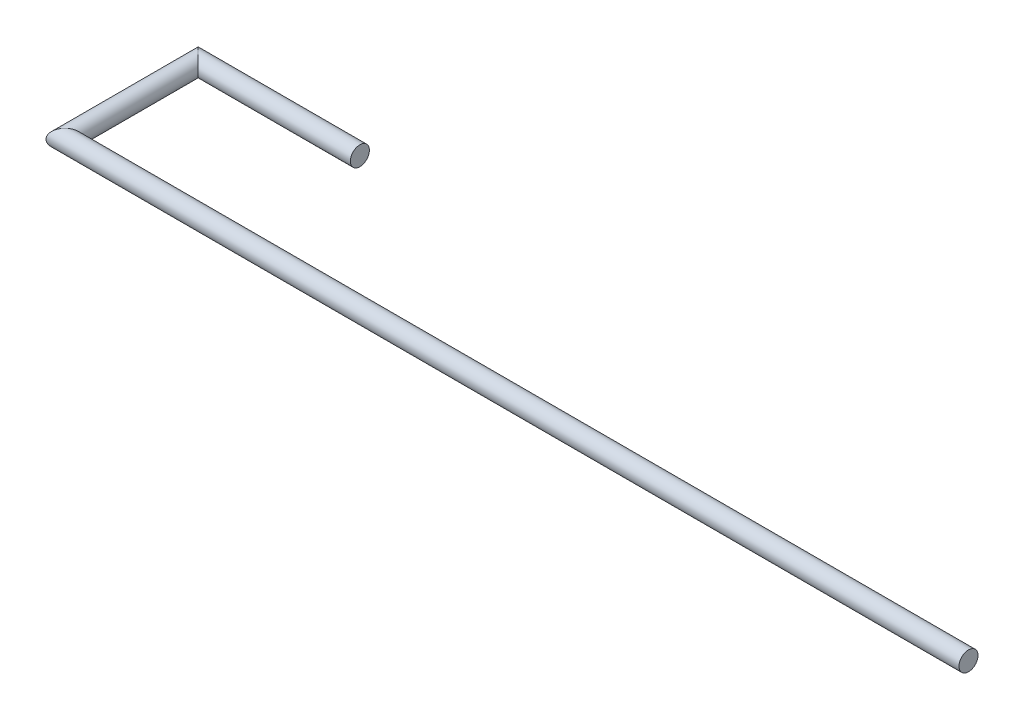
ISO-10303-21;
HEADER;
FILE_DESCRIPTION(('STEP AP214'),'2;1');
FILE_NAME('part.step','',(''),(''),'','','');
FILE_SCHEMA(('AUTOMOTIVE_DESIGN { 1 0 10303 214 1 1 1 1 }'));
ENDSEC;
DATA;
#1=APPLICATION_CONTEXT('core data for automotive mechanical design processes');
#2=APPLICATION_PROTOCOL_DEFINITION('international standard','automotive_design',2000,#1);
#3=PRODUCT_CONTEXT('',#1,'mechanical');
#4=PRODUCT('Part','Part','',(#3));
#5=PRODUCT_RELATED_PRODUCT_CATEGORY('part','',(#4));
#6=PRODUCT_DEFINITION_FORMATION('','',#4);
#7=PRODUCT_DEFINITION_CONTEXT('part definition',#1,'design');
#8=PRODUCT_DEFINITION('design','',#6,#7);
#9=PRODUCT_DEFINITION_SHAPE('','',#8);
#10=(LENGTH_UNIT() NAMED_UNIT(*) SI_UNIT(.MILLI.,.METRE.));
#11=(NAMED_UNIT(*) PLANE_ANGLE_UNIT() SI_UNIT($,.RADIAN.));
#12=(NAMED_UNIT(*) SI_UNIT($,.STERADIAN.) SOLID_ANGLE_UNIT());
#13=UNCERTAINTY_MEASURE_WITH_UNIT(LENGTH_MEASURE(1.E-05),#10,'distance_accuracy_value','');
#14=(GEOMETRIC_REPRESENTATION_CONTEXT(3) GLOBAL_UNCERTAINTY_ASSIGNED_CONTEXT((#13)) GLOBAL_UNIT_ASSIGNED_CONTEXT((#10,
#11,#12)) REPRESENTATION_CONTEXT('',''));
#15=CARTESIAN_POINT('',(0.,0.,0.));
#16=DIRECTION('',(0.,0.,1.));
#17=DIRECTION('',(1.,0.,0.));
#18=AXIS2_PLACEMENT_3D('',#15,#16,#17);
#19=CARTESIAN_POINT('',(234.975667778959,0.,32.5));
#20=DIRECTION('',(-1.,0.,0.));
#21=DIRECTION('',(0.,0.,1.));
#22=AXIS2_PLACEMENT_3D('',#19,#20,#21);
#23=PLANE('',#22);
#24=CARTESIAN_POINT('',(234.975667778959,0.,32.5));
#25=DIRECTION('',(-1.,0.,0.));
#26=DIRECTION('',(0.,0.,1.));
#27=AXIS2_PLACEMENT_3D('',#24,#25,#26);
#28=CIRCLE('',#27,2.5);
#29=CARTESIAN_POINT('',(234.975667778959,0.,35.));
#30=VERTEX_POINT('',#29);
#31=EDGE_CURVE('E50',#30,#30,#28,.T.);
#32=ORIENTED_EDGE('',*,*,#31,.F.);
#33=EDGE_LOOP('',(#32));
#34=FACE_BOUND('',#33,.T.);
#35=ADVANCED_FACE('F47',(#34),#23,.F.);
#36=CARTESIAN_POINT('',(40.,0.,-2.5));
#37=DIRECTION('',(1.,0.,0.));
#38=DIRECTION('',(0.,0.,-1.));
#39=AXIS2_PLACEMENT_3D('',#36,#37,#38);
#40=PLANE('',#39);
#41=CARTESIAN_POINT('',(40.,0.,-2.5));
#42=DIRECTION('',(1.,0.,0.));
#43=DIRECTION('',(0.,0.,-1.));
#44=AXIS2_PLACEMENT_3D('',#41,#42,#43);
#45=CIRCLE('',#44,2.5);
#46=CARTESIAN_POINT('',(40.,0.,-5.));
#47=VERTEX_POINT('',#46);
#48=EDGE_CURVE('E55',#47,#47,#45,.T.);
#49=ORIENTED_EDGE('',*,*,#48,.T.);
#50=EDGE_LOOP('',(#49));
#51=FACE_BOUND('',#50,.T.);
#52=ADVANCED_FACE('F74',(#51),#40,.T.);
#53=CARTESIAN_POINT('',(-5.34999999999999,0.,32.5));
#54=DIRECTION('',(1.,0.,0.));
#55=DIRECTION('',(0.,0.,-1.));
#56=AXIS2_PLACEMENT_3D('',#53,#54,#55);
#57=CYLINDRICAL_SURFACE('',#56,2.5);
#58=CARTESIAN_POINT('',(-2.5,0.,32.5));
#59=DIRECTION('',(0.707106781186548,0.,0.707106781186547));
#60=DIRECTION('',(-0.707106781186547,0.,0.707106781186548));
#61=AXIS2_PLACEMENT_3D('',#58,#59,#60);
#62=ELLIPSE('',#61,3.53553390593274,2.5);
#63=CARTESIAN_POINT('',(-5.,0.,35.));
#64=VERTEX_POINT('',#63);
#65=EDGE_CURVE('E61',#64,#64,#62,.T.);
#66=ORIENTED_EDGE('',*,*,#65,.T.);
#67=EDGE_LOOP('',(#66));
#68=FACE_BOUND('',#67,.T.);
#69=ORIENTED_EDGE('',*,*,#31,.T.);
#70=EDGE_LOOP('',(#69));
#71=FACE_BOUND('',#70,.T.);
#72=ADVANCED_FACE('F71',(#68,#71),#57,.T.);
#73=CARTESIAN_POINT('',(-2.5,0.,-5.34999999999999));
#74=DIRECTION('',(0.,0.,1.));
#75=DIRECTION('',(1.,0.,0.));
#76=AXIS2_PLACEMENT_3D('',#73,#74,#75);
#77=CYLINDRICAL_SURFACE('',#76,2.5);
#78=CARTESIAN_POINT('',(-2.5,0.,-2.49999999999999));
#79=DIRECTION('',(-0.707106781186547,0.,0.707106781186548));
#80=DIRECTION('',(-0.707106781186548,0.,-0.707106781186547));
#81=AXIS2_PLACEMENT_3D('',#78,#79,#80);
#82=ELLIPSE('',#81,3.53553390593274,2.5);
#83=CARTESIAN_POINT('',(-5.00000000000001,0.,-5.));
#84=VERTEX_POINT('',#83);
#85=EDGE_CURVE('E11',#84,#84,#82,.T.);
#86=ORIENTED_EDGE('',*,*,#85,.T.);
#87=EDGE_LOOP('',(#86));
#88=FACE_BOUND('',#87,.T.);
#89=ORIENTED_EDGE('',*,*,#65,.F.);
#90=EDGE_LOOP('',(#89));
#91=FACE_BOUND('',#90,.T.);
#92=ADVANCED_FACE('F81',(#88,#91),#77,.T.);
#93=CARTESIAN_POINT('',(40.,0.,-2.5));
#94=DIRECTION('',(-1.,0.,0.));
#95=DIRECTION('',(0.,0.,1.));
#96=AXIS2_PLACEMENT_3D('',#93,#94,#95);
#97=CYLINDRICAL_SURFACE('',#96,2.5);
#98=ORIENTED_EDGE('',*,*,#48,.F.);
#99=EDGE_LOOP('',(#98));
#100=FACE_BOUND('',#99,.T.);
#101=ORIENTED_EDGE('',*,*,#85,.F.);
#102=EDGE_LOOP('',(#101));
#103=FACE_BOUND('',#102,.T.);
#104=ADVANCED_FACE('F79',(#100,#103),#97,.T.);
#105=CLOSED_SHELL('',(#35,#52,#72,#92,#104));
#106=MANIFOLD_SOLID_BREP('B2',#105);
#107=ADVANCED_BREP_SHAPE_REPRESENTATION('',(#18,#106),#14);
#108=SHAPE_DEFINITION_REPRESENTATION(#9,#107);
ENDSEC;
END-ISO-10303-21;
